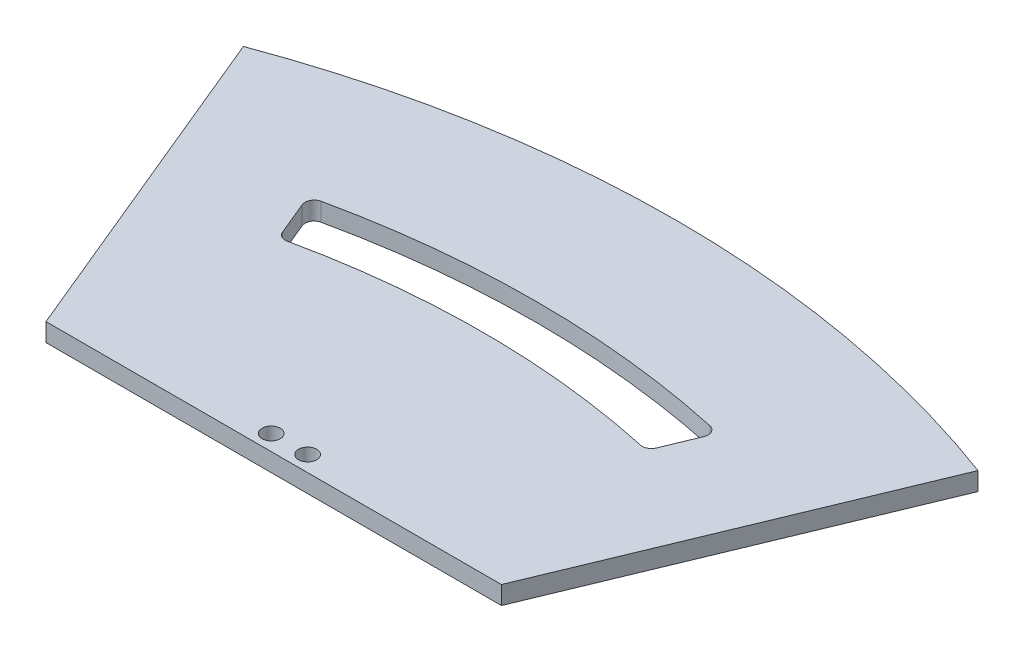
ISO-10303-21;
HEADER;
FILE_DESCRIPTION(('STEP AP214'),'2;1');
FILE_NAME('part.step','',(''),(''),'','','');
FILE_SCHEMA(('AUTOMOTIVE_DESIGN { 1 0 10303 214 1 1 1 1 }'));
ENDSEC;
DATA;
#1=APPLICATION_CONTEXT('core data for automotive mechanical design processes');
#2=APPLICATION_PROTOCOL_DEFINITION('international standard','automotive_design',2000,#1);
#3=PRODUCT_CONTEXT('',#1,'mechanical');
#4=PRODUCT('Part','Part','',(#3));
#5=PRODUCT_RELATED_PRODUCT_CATEGORY('part','',(#4));
#6=PRODUCT_DEFINITION_FORMATION('','',#4);
#7=PRODUCT_DEFINITION_CONTEXT('part definition',#1,'design');
#8=PRODUCT_DEFINITION('design','',#6,#7);
#9=PRODUCT_DEFINITION_SHAPE('','',#8);
#10=(LENGTH_UNIT() NAMED_UNIT(*) SI_UNIT(.MILLI.,.METRE.));
#11=(NAMED_UNIT(*) PLANE_ANGLE_UNIT() SI_UNIT($,.RADIAN.));
#12=(NAMED_UNIT(*) SI_UNIT($,.STERADIAN.) SOLID_ANGLE_UNIT());
#13=UNCERTAINTY_MEASURE_WITH_UNIT(LENGTH_MEASURE(1.E-05),#10,'distance_accuracy_value','');
#14=(GEOMETRIC_REPRESENTATION_CONTEXT(3) GLOBAL_UNCERTAINTY_ASSIGNED_CONTEXT((#13)) GLOBAL_UNIT_ASSIGNED_CONTEXT((#10,
#11,#12)) REPRESENTATION_CONTEXT('',''));
#15=CARTESIAN_POINT('',(0.,0.,0.));
#16=DIRECTION('',(0.,0.,1.));
#17=DIRECTION('',(1.,0.,0.));
#18=AXIS2_PLACEMENT_3D('',#15,#16,#17);
#19=CARTESIAN_POINT('',(0.,-2.5,-1.38777878078145E-13));
#20=DIRECTION('',(0.,-1.,0.));
#21=DIRECTION('',(0.,0.,-1.));
#22=AXIS2_PLACEMENT_3D('',#19,#20,#21);
#23=PLANE('',#22);
#24=CARTESIAN_POINT('',(26.4088077727216,-2.5,-121.666860204509));
#25=DIRECTION('',(0.,1.,0.));
#26=DIRECTION('',(0.,0.,1.));
#27=AXIS2_PLACEMENT_3D('',#24,#25,#26);
#28=CIRCLE('',#27,1.25);
#29=CARTESIAN_POINT('',(27.5636571883608,-2.5,-121.188505914052));
#30=VERTEX_POINT('',#29);
#31=CARTESIAN_POINT('',(26.6739564451385,-2.5,-122.888415025839));
#32=VERTEX_POINT('',#31);
#33=EDGE_CURVE('E75',#30,#32,#28,.T.);
#34=ORIENTED_EDGE('',*,*,#33,.T.);
#35=CARTESIAN_POINT('',(0.,-2.5,-1.38777878078145E-13));
#36=DIRECTION('',(0.,1.,0.));
#37=DIRECTION('',(0.,0.,1.));
#38=AXIS2_PLACEMENT_3D('',#35,#36,#37);
#39=CIRCLE('',#38,125.75);
#40=CARTESIAN_POINT('',(-26.6739564451385,-2.5,-122.888415025839));
#41=VERTEX_POINT('',#40);
#42=EDGE_CURVE('E258',#32,#41,#39,.T.);
#43=ORIENTED_EDGE('',*,*,#42,.T.);
#44=CARTESIAN_POINT('',(-26.4088077727217,-2.5,-121.666860204509));
#45=DIRECTION('',(0.,1.,0.));
#46=DIRECTION('',(0.,0.,1.));
#47=AXIS2_PLACEMENT_3D('',#44,#45,#46);
#48=CIRCLE('',#47,1.25);
#49=CARTESIAN_POINT('',(-27.5636571883608,-2.5,-121.188505914052));
#50=VERTEX_POINT('',#49);
#51=EDGE_CURVE('E50',#41,#50,#48,.T.);
#52=ORIENTED_EDGE('',*,*,#51,.T.);
#53=DIRECTION('',(0.382683432365087,0.,0.923879532511288));
#54=VECTOR('',#53,1.);
#55=CARTESIAN_POINT('',(-27.5636571883608,-2.5,-121.188505914052));
#56=LINE('',#55,#54);
#57=CARTESIAN_POINT('',(-25.6502400265353,-2.5,-116.569108251496));
#58=VERTEX_POINT('',#57);
#59=EDGE_CURVE('E126',#50,#58,#56,.T.);
#60=ORIENTED_EDGE('',*,*,#59,.T.);
#61=CARTESIAN_POINT('',(-24.4953906108962,-2.5,-117.047462541952));
#62=DIRECTION('',(0.,1.,0.));
#63=DIRECTION('',(0.,0.,1.));
#64=AXIS2_PLACEMENT_3D('',#61,#62,#63);
#65=CIRCLE('',#64,1.24999999999999);
#66=CARTESIAN_POINT('',(-24.2302889809081,-2.5,-115.825897510618));
#67=VERTEX_POINT('',#66);
#68=EDGE_CURVE('E254',#58,#67,#65,.T.);
#69=ORIENTED_EDGE('',*,*,#68,.T.);
#70=CARTESIAN_POINT('',(0.,-2.5,-4.17485364670413));
#71=DIRECTION('',(0.,-1.,0.));
#72=DIRECTION('',(0.,0.,1.));
#73=AXIS2_PLACEMENT_3D('',#70,#71,#72);
#74=CIRCLE('',#73,114.25);
#75=CARTESIAN_POINT('',(24.2302889809081,-2.5,-115.825897510618));
#76=VERTEX_POINT('',#75);
#77=EDGE_CURVE('E240',#67,#76,#74,.T.);
#78=ORIENTED_EDGE('',*,*,#77,.T.);
#79=CARTESIAN_POINT('',(24.4953906108962,-2.5,-117.047462541952));
#80=DIRECTION('',(0.,1.,0.));
#81=DIRECTION('',(0.,0.,1.));
#82=AXIS2_PLACEMENT_3D('',#79,#80,#81);
#83=CIRCLE('',#82,1.25);
#84=CARTESIAN_POINT('',(25.6502400265353,-2.5,-116.569108251496));
#85=VERTEX_POINT('',#84);
#86=EDGE_CURVE('E248',#76,#85,#83,.T.);
#87=ORIENTED_EDGE('',*,*,#86,.T.);
#88=DIRECTION('',(0.382683432365089,0.,-0.923879532511287));
#89=VECTOR('',#88,1.);
#90=CARTESIAN_POINT('',(27.5636571883608,-2.5,-121.188505914052));
#91=LINE('',#90,#89);
#92=EDGE_CURVE('E247',#85,#30,#91,.T.);
#93=ORIENTED_EDGE('',*,*,#92,.T.);
#94=EDGE_LOOP('',(#34,#43,#52,#60,#69,#78,#87,#93));
#95=FACE_BOUND('',#94,.T.);
#96=CARTESIAN_POINT('',(-2.5,-2.5,-91.8683298050514));
#97=DIRECTION('',(0.,1.,0.));
#98=DIRECTION('',(0.,0.,1.));
#99=AXIS2_PLACEMENT_3D('',#96,#97,#98);
#100=CIRCLE('',#99,1.25);
#101=CARTESIAN_POINT('',(-2.5,-2.5,-90.6183298050514));
#102=VERTEX_POINT('',#101);
#103=EDGE_CURVE('E135',#102,#102,#100,.T.);
#104=ORIENTED_EDGE('',*,*,#103,.T.);
#105=EDGE_LOOP('',(#104));
#106=FACE_BOUND('',#105,.T.);
#107=CARTESIAN_POINT('',(0.,-2.5,-1.38777878078145E-13));
#108=DIRECTION('',(0.,-1.,0.));
#109=DIRECTION('',(0.,0.,-1.));
#110=AXIS2_PLACEMENT_3D('',#107,#108,#109);
#111=CIRCLE('',#110,145.);
#112=CARTESIAN_POINT('',(-50.404915860436,-2.5,-135.957141986371));
#113=VERTEX_POINT('',#112);
#114=CARTESIAN_POINT('',(50.404915860436,-2.5,-135.957141986371));
#115=VERTEX_POINT('',#114);
#116=EDGE_CURVE('E147',#113,#115,#111,.T.);
#117=ORIENTED_EDGE('',*,*,#116,.T.);
#118=DIRECTION('',(-0.382683432365084,0.,0.92387953251129));
#119=VECTOR('',#118,1.);
#120=CARTESIAN_POINT('',(50.404915860436,-2.5,-135.957141986371));
#121=LINE('',#120,#119);
#122=CARTESIAN_POINT('',(31.25,-2.5,-89.7130843299906));
#123=VERTEX_POINT('',#122);
#124=EDGE_CURVE('E150',#115,#123,#121,.T.);
#125=ORIENTED_EDGE('',*,*,#124,.T.);
#126=DIRECTION('',(1.,0.,0.));
#127=VECTOR('',#126,1.);
#128=CARTESIAN_POINT('',(-31.25,-2.5,-89.7130843299906));
#129=LINE('',#128,#127);
#130=CARTESIAN_POINT('',(-31.25,-2.5,-89.7130843299906));
#131=VERTEX_POINT('',#130);
#132=EDGE_CURVE('E154',#131,#123,#129,.T.);
#133=ORIENTED_EDGE('',*,*,#132,.F.);
#134=DIRECTION('',(0.382683432365084,0.,0.92387953251129));
#135=VECTOR('',#134,1.);
#136=CARTESIAN_POINT('',(-50.404915860436,-2.5,-135.957141986371));
#137=LINE('',#136,#135);
#138=EDGE_CURVE('E157',#113,#131,#137,.T.);
#139=ORIENTED_EDGE('',*,*,#138,.F.);
#140=EDGE_LOOP('',(#117,#125,#133,#139));
#141=FACE_BOUND('',#140,.T.);
#142=CARTESIAN_POINT('',(2.5,-2.5,-91.8683298050514));
#143=DIRECTION('',(0.,1.,0.));
#144=DIRECTION('',(0.,0.,1.));
#145=AXIS2_PLACEMENT_3D('',#142,#143,#144);
#146=CIRCLE('',#145,1.25);
#147=CARTESIAN_POINT('',(2.5,-2.5,-90.6183298050514));
#148=VERTEX_POINT('',#147);
#149=EDGE_CURVE('E141',#148,#148,#146,.F.);
#150=ORIENTED_EDGE('',*,*,#149,.F.);
#151=EDGE_LOOP('',(#150));
#152=FACE_BOUND('',#151,.T.);
#153=ADVANCED_FACE('F32',(#95,#106,#141,#152),#23,.T.);
#154=CARTESIAN_POINT('',(0.,0.,-1.38777878078145E-13));
#155=DIRECTION('',(0.,-1.,0.));
#156=DIRECTION('',(0.,0.,-1.));
#157=AXIS2_PLACEMENT_3D('',#154,#155,#156);
#158=PLANE('',#157);
#159=CARTESIAN_POINT('',(0.,0.,-1.38777878078145E-13));
#160=DIRECTION('',(0.,-1.,0.));
#161=DIRECTION('',(0.,0.,-1.));
#162=AXIS2_PLACEMENT_3D('',#159,#160,#161);
#163=CIRCLE('',#162,125.75);
#164=CARTESIAN_POINT('',(-26.6739564451385,0.,-122.888415025839));
#165=VERTEX_POINT('',#164);
#166=CARTESIAN_POINT('',(26.6739564451385,0.,-122.888415025839));
#167=VERTEX_POINT('',#166);
#168=EDGE_CURVE('E93',#165,#167,#163,.T.);
#169=ORIENTED_EDGE('',*,*,#168,.T.);
#170=CARTESIAN_POINT('',(26.4088077727216,0.,-121.666860204509));
#171=DIRECTION('',(0.,-1.,0.));
#172=DIRECTION('',(0.,0.,-1.));
#173=AXIS2_PLACEMENT_3D('',#170,#171,#172);
#174=CIRCLE('',#173,1.25);
#175=CARTESIAN_POINT('',(27.5636571883608,0.,-121.188505914052));
#176=VERTEX_POINT('',#175);
#177=EDGE_CURVE('E11',#167,#176,#174,.T.);
#178=ORIENTED_EDGE('',*,*,#177,.T.);
#179=DIRECTION('',(-0.382683432365089,0.,0.923879532511287));
#180=VECTOR('',#179,1.);
#181=CARTESIAN_POINT('',(27.5636571883608,0.,-121.188505914052));
#182=LINE('',#181,#180);
#183=CARTESIAN_POINT('',(25.6502400265353,0.,-116.569108251496));
#184=VERTEX_POINT('',#183);
#185=EDGE_CURVE('E36',#176,#184,#182,.T.);
#186=ORIENTED_EDGE('',*,*,#185,.T.);
#187=CARTESIAN_POINT('',(24.4953906108962,0.,-117.047462541952));
#188=DIRECTION('',(0.,-1.,0.));
#189=DIRECTION('',(0.,0.,-1.));
#190=AXIS2_PLACEMENT_3D('',#187,#188,#189);
#191=CIRCLE('',#190,1.25);
#192=CARTESIAN_POINT('',(24.2302889809081,0.,-115.825897510618));
#193=VERTEX_POINT('',#192);
#194=EDGE_CURVE('E88',#184,#193,#191,.T.);
#195=ORIENTED_EDGE('',*,*,#194,.T.);
#196=CARTESIAN_POINT('',(0.,0.,-4.17485364670413));
#197=DIRECTION('',(0.,-1.,0.));
#198=DIRECTION('',(0.,0.,-1.));
#199=AXIS2_PLACEMENT_3D('',#196,#197,#198);
#200=CIRCLE('',#199,114.25);
#201=CARTESIAN_POINT('',(-24.2302889809081,0.,-115.825897510618));
#202=VERTEX_POINT('',#201);
#203=EDGE_CURVE('E110',#193,#202,#200,.F.);
#204=ORIENTED_EDGE('',*,*,#203,.T.);
#205=CARTESIAN_POINT('',(-24.4953906108962,0.,-117.047462541952));
#206=DIRECTION('',(0.,-1.,0.));
#207=DIRECTION('',(0.,0.,-1.));
#208=AXIS2_PLACEMENT_3D('',#205,#206,#207);
#209=CIRCLE('',#208,1.24999999999999);
#210=CARTESIAN_POINT('',(-25.6502400265353,0.,-116.569108251496));
#211=VERTEX_POINT('',#210);
#212=EDGE_CURVE('E107',#202,#211,#209,.T.);
#213=ORIENTED_EDGE('',*,*,#212,.T.);
#214=DIRECTION('',(-0.382683432365087,0.,-0.923879532511288));
#215=VECTOR('',#214,1.);
#216=CARTESIAN_POINT('',(-25.6502400265353,0.,-116.569108251496));
#217=LINE('',#216,#215);
#218=CARTESIAN_POINT('',(-27.5636571883608,0.,-121.188505914052));
#219=VERTEX_POINT('',#218);
#220=EDGE_CURVE('E100',#211,#219,#217,.T.);
#221=ORIENTED_EDGE('',*,*,#220,.T.);
#222=CARTESIAN_POINT('',(-26.4088077727217,0.,-121.666860204509));
#223=DIRECTION('',(0.,-1.,0.));
#224=DIRECTION('',(0.,0.,-1.));
#225=AXIS2_PLACEMENT_3D('',#222,#223,#224);
#226=CIRCLE('',#225,1.25);
#227=EDGE_CURVE('E96',#219,#165,#226,.T.);
#228=ORIENTED_EDGE('',*,*,#227,.T.);
#229=EDGE_LOOP('',(#169,#178,#186,#195,#204,#213,#221,#228));
#230=FACE_BOUND('',#229,.T.);
#231=CARTESIAN_POINT('',(-2.5,0.,-91.8683298050514));
#232=DIRECTION('',(0.,1.,0.));
#233=DIRECTION('',(0.,0.,1.));
#234=AXIS2_PLACEMENT_3D('',#231,#232,#233);
#235=CIRCLE('',#234,1.25);
#236=CARTESIAN_POINT('',(-2.5,0.,-90.6183298050514));
#237=VERTEX_POINT('',#236);
#238=EDGE_CURVE('E79',#237,#237,#235,.T.);
#239=ORIENTED_EDGE('',*,*,#238,.F.);
#240=EDGE_LOOP('',(#239));
#241=FACE_BOUND('',#240,.T.);
#242=CARTESIAN_POINT('',(2.5,0.,-91.8683298050514));
#243=DIRECTION('',(0.,1.,0.));
#244=DIRECTION('',(0.,0.,1.));
#245=AXIS2_PLACEMENT_3D('',#242,#243,#244);
#246=CIRCLE('',#245,1.25);
#247=CARTESIAN_POINT('',(2.5,0.,-90.6183298050514));
#248=VERTEX_POINT('',#247);
#249=EDGE_CURVE('E138',#248,#248,#246,.F.);
#250=ORIENTED_EDGE('',*,*,#249,.T.);
#251=EDGE_LOOP('',(#250));
#252=FACE_BOUND('',#251,.T.);
#253=CARTESIAN_POINT('',(0.,0.,-1.38777878078145E-13));
#254=DIRECTION('',(0.,-1.,0.));
#255=DIRECTION('',(0.,0.,-1.));
#256=AXIS2_PLACEMENT_3D('',#253,#254,#255);
#257=CIRCLE('',#256,145.);
#258=CARTESIAN_POINT('',(-50.404915860436,0.,-135.957141986371));
#259=VERTEX_POINT('',#258);
#260=CARTESIAN_POINT('',(50.404915860436,0.,-135.957141986371));
#261=VERTEX_POINT('',#260);
#262=EDGE_CURVE('E144',#259,#261,#257,.T.);
#263=ORIENTED_EDGE('',*,*,#262,.F.);
#264=DIRECTION('',(0.382683432365084,0.,0.92387953251129));
#265=VECTOR('',#264,1.);
#266=CARTESIAN_POINT('',(-50.404915860436,0.,-135.957141986371));
#267=LINE('',#266,#265);
#268=CARTESIAN_POINT('',(-31.25,0.,-89.7130843299906));
#269=VERTEX_POINT('',#268);
#270=EDGE_CURVE('E151',#259,#269,#267,.T.);
#271=ORIENTED_EDGE('',*,*,#270,.T.);
#272=DIRECTION('',(1.,0.,0.));
#273=VECTOR('',#272,1.);
#274=CARTESIAN_POINT('',(-31.25,0.,-89.7130843299906));
#275=LINE('',#274,#273);
#276=CARTESIAN_POINT('',(31.25,0.,-89.7130843299906));
#277=VERTEX_POINT('',#276);
#278=EDGE_CURVE('E166',#269,#277,#275,.T.);
#279=ORIENTED_EDGE('',*,*,#278,.T.);
#280=DIRECTION('',(-0.382683432365084,0.,0.92387953251129));
#281=VECTOR('',#280,1.);
#282=CARTESIAN_POINT('',(50.404915860436,0.,-135.957141986371));
#283=LINE('',#282,#281);
#284=EDGE_CURVE('E163',#261,#277,#283,.T.);
#285=ORIENTED_EDGE('',*,*,#284,.F.);
#286=EDGE_LOOP('',(#263,#271,#279,#285));
#287=FACE_BOUND('',#286,.T.);
#288=ADVANCED_FACE('F89',(#230,#241,#252,#287),#158,.F.);
#289=CARTESIAN_POINT('',(0.,-2.5,-1.38777878078145E-13));
#290=DIRECTION('',(0.,1.,0.));
#291=DIRECTION('',(0.,0.,1.));
#292=AXIS2_PLACEMENT_3D('',#289,#290,#291);
#293=CYLINDRICAL_SURFACE('',#292,145.);
#294=ORIENTED_EDGE('',*,*,#262,.T.);
#295=DIRECTION('',(0.,1.,0.));
#296=VECTOR('',#295,1.);
#297=CARTESIAN_POINT('',(50.404915860436,-2.5,-135.957141986371));
#298=LINE('',#297,#296);
#299=EDGE_CURVE('E98',#115,#261,#298,.T.);
#300=ORIENTED_EDGE('',*,*,#299,.F.);
#301=ORIENTED_EDGE('',*,*,#116,.F.);
#302=DIRECTION('',(0.,1.,0.));
#303=VECTOR('',#302,1.);
#304=CARTESIAN_POINT('',(-50.404915860436,-2.5,-135.957141986371));
#305=LINE('',#304,#303);
#306=EDGE_CURVE('E160',#113,#259,#305,.T.);
#307=ORIENTED_EDGE('',*,*,#306,.T.);
#308=EDGE_LOOP('',(#294,#300,#301,#307));
#309=FACE_BOUND('',#308,.T.);
#310=ADVANCED_FACE('F34',(#309),#293,.T.);
#311=CARTESIAN_POINT('',(50.404915860436,-2.5,-135.957141986371));
#312=DIRECTION('',(-0.923879532511289,0.,-0.382683432365084));
#313=DIRECTION('',(-0.382683432365084,0.,0.923879532511289));
#314=AXIS2_PLACEMENT_3D('',#311,#312,#313);
#315=PLANE('',#314);
#316=ORIENTED_EDGE('',*,*,#284,.T.);
#317=DIRECTION('',(0.,1.,0.));
#318=VECTOR('',#317,1.);
#319=CARTESIAN_POINT('',(31.25,-2.5,-89.7130843299906));
#320=LINE('',#319,#318);
#321=EDGE_CURVE('E103',#123,#277,#320,.T.);
#322=ORIENTED_EDGE('',*,*,#321,.F.);
#323=ORIENTED_EDGE('',*,*,#124,.F.);
#324=ORIENTED_EDGE('',*,*,#299,.T.);
#325=EDGE_LOOP('',(#316,#322,#323,#324));
#326=FACE_BOUND('',#325,.T.);
#327=ADVANCED_FACE('F190',(#326),#315,.F.);
#328=CARTESIAN_POINT('',(-31.25,-2.5,-89.7130843299906));
#329=DIRECTION('',(0.,0.,1.));
#330=DIRECTION('',(1.,0.,0.));
#331=AXIS2_PLACEMENT_3D('',#328,#329,#330);
#332=PLANE('',#331);
#333=ORIENTED_EDGE('',*,*,#278,.F.);
#334=DIRECTION('',(0.,1.,0.));
#335=VECTOR('',#334,1.);
#336=CARTESIAN_POINT('',(-31.25,-2.5,-89.7130843299906));
#337=LINE('',#336,#335);
#338=EDGE_CURVE('E173',#131,#269,#337,.T.);
#339=ORIENTED_EDGE('',*,*,#338,.F.);
#340=ORIENTED_EDGE('',*,*,#132,.T.);
#341=ORIENTED_EDGE('',*,*,#321,.T.);
#342=EDGE_LOOP('',(#333,#339,#340,#341));
#343=FACE_BOUND('',#342,.T.);
#344=ADVANCED_FACE('F180',(#343),#332,.T.);
#345=CARTESIAN_POINT('',(-50.404915860436,-2.5,-135.957141986371));
#346=DIRECTION('',(-0.923879532511289,0.,0.382683432365084));
#347=DIRECTION('',(0.382683432365084,0.,0.923879532511289));
#348=AXIS2_PLACEMENT_3D('',#345,#346,#347);
#349=PLANE('',#348);
#350=ORIENTED_EDGE('',*,*,#270,.F.);
#351=ORIENTED_EDGE('',*,*,#306,.F.);
#352=ORIENTED_EDGE('',*,*,#138,.T.);
#353=ORIENTED_EDGE('',*,*,#338,.T.);
#354=EDGE_LOOP('',(#350,#351,#352,#353));
#355=FACE_BOUND('',#354,.T.);
#356=ADVANCED_FACE('F199',(#355),#349,.T.);
#357=CARTESIAN_POINT('',(2.5,-2.5,-91.8683298050514));
#358=DIRECTION('',(0.,1.,0.));
#359=DIRECTION('',(0.,0.,1.));
#360=AXIS2_PLACEMENT_3D('',#357,#358,#359);
#361=CYLINDRICAL_SURFACE('',#360,1.25);
#362=ORIENTED_EDGE('',*,*,#149,.T.);
#363=EDGE_LOOP('',(#362));
#364=FACE_BOUND('',#363,.T.);
#365=ORIENTED_EDGE('',*,*,#249,.F.);
#366=EDGE_LOOP('',(#365));
#367=FACE_BOUND('',#366,.T.);
#368=ADVANCED_FACE('F280',(#364,#367),#361,.F.);
#369=CARTESIAN_POINT('',(-2.5,-2.5,-91.8683298050514));
#370=DIRECTION('',(0.,1.,0.));
#371=DIRECTION('',(0.,0.,1.));
#372=AXIS2_PLACEMENT_3D('',#369,#370,#371);
#373=CYLINDRICAL_SURFACE('',#372,1.25);
#374=ORIENTED_EDGE('',*,*,#103,.F.);
#375=EDGE_LOOP('',(#374));
#376=FACE_BOUND('',#375,.T.);
#377=ORIENTED_EDGE('',*,*,#238,.T.);
#378=EDGE_LOOP('',(#377));
#379=FACE_BOUND('',#378,.T.);
#380=ADVANCED_FACE('F299',(#376,#379),#373,.F.);
#381=CARTESIAN_POINT('',(26.4088077727216,-2.5,-121.666860204509));
#382=DIRECTION('',(0.,1.,0.));
#383=DIRECTION('',(0.,0.,1.));
#384=AXIS2_PLACEMENT_3D('',#381,#382,#383);
#385=CYLINDRICAL_SURFACE('',#384,1.25);
#386=DIRECTION('',(0.,1.,0.));
#387=VECTOR('',#386,1.);
#388=CARTESIAN_POINT('',(26.6739564451385,-2.5,-122.888415025839));
#389=LINE('',#388,#387);
#390=EDGE_CURVE('E131',#32,#167,#389,.T.);
#391=ORIENTED_EDGE('',*,*,#390,.F.);
#392=ORIENTED_EDGE('',*,*,#33,.F.);
#393=DIRECTION('',(0.,1.,0.));
#394=VECTOR('',#393,1.);
#395=CARTESIAN_POINT('',(27.5636571883608,-2.5,-121.188505914052));
#396=LINE('',#395,#394);
#397=EDGE_CURVE('E68',#30,#176,#396,.T.);
#398=ORIENTED_EDGE('',*,*,#397,.T.);
#399=ORIENTED_EDGE('',*,*,#177,.F.);
#400=EDGE_LOOP('',(#391,#392,#398,#399));
#401=FACE_BOUND('',#400,.T.);
#402=ADVANCED_FACE('F71',(#401),#385,.F.);
#403=CARTESIAN_POINT('',(27.5636571883608,-2.5,-121.188505914052));
#404=DIRECTION('',(0.923879532511287,0.,0.382683432365089));
#405=DIRECTION('',(0.382683432365089,0.,-0.923879532511287));
#406=AXIS2_PLACEMENT_3D('',#403,#404,#405);
#407=PLANE('',#406);
#408=ORIENTED_EDGE('',*,*,#397,.F.);
#409=ORIENTED_EDGE('',*,*,#92,.F.);
#410=DIRECTION('',(0.,1.,0.));
#411=VECTOR('',#410,1.);
#412=CARTESIAN_POINT('',(25.6502400265353,-2.5,-116.569108251496));
#413=LINE('',#412,#411);
#414=EDGE_CURVE('E80',#85,#184,#413,.T.);
#415=ORIENTED_EDGE('',*,*,#414,.T.);
#416=ORIENTED_EDGE('',*,*,#185,.F.);
#417=EDGE_LOOP('',(#408,#409,#415,#416));
#418=FACE_BOUND('',#417,.T.);
#419=ADVANCED_FACE('F84',(#418),#407,.F.);
#420=CARTESIAN_POINT('',(24.4953906108962,-2.5,-117.047462541952));
#421=DIRECTION('',(0.,1.,0.));
#422=DIRECTION('',(0.,0.,1.));
#423=AXIS2_PLACEMENT_3D('',#420,#421,#422);
#424=CYLINDRICAL_SURFACE('',#423,1.25);
#425=ORIENTED_EDGE('',*,*,#414,.F.);
#426=ORIENTED_EDGE('',*,*,#86,.F.);
#427=DIRECTION('',(0.,1.,0.));
#428=VECTOR('',#427,1.);
#429=CARTESIAN_POINT('',(24.2302889809081,-2.5,-115.825897510618));
#430=LINE('',#429,#428);
#431=EDGE_CURVE('E234',#76,#193,#430,.T.);
#432=ORIENTED_EDGE('',*,*,#431,.T.);
#433=ORIENTED_EDGE('',*,*,#194,.F.);
#434=EDGE_LOOP('',(#425,#426,#432,#433));
#435=FACE_BOUND('',#434,.T.);
#436=ADVANCED_FACE('F232',(#435),#424,.F.);
#437=CARTESIAN_POINT('',(0.,-2.5,-4.17485364670413));
#438=DIRECTION('',(0.,1.,0.));
#439=DIRECTION('',(0.,0.,1.));
#440=AXIS2_PLACEMENT_3D('',#437,#438,#439);
#441=CYLINDRICAL_SURFACE('',#440,114.25);
#442=ORIENTED_EDGE('',*,*,#431,.F.);
#443=ORIENTED_EDGE('',*,*,#77,.F.);
#444=DIRECTION('',(0.,1.,0.));
#445=VECTOR('',#444,1.);
#446=CARTESIAN_POINT('',(-24.2302889809081,-2.5,-115.825897510618));
#447=LINE('',#446,#445);
#448=EDGE_CURVE('E129',#67,#202,#447,.T.);
#449=ORIENTED_EDGE('',*,*,#448,.T.);
#450=ORIENTED_EDGE('',*,*,#203,.F.);
#451=EDGE_LOOP('',(#442,#443,#449,#450));
#452=FACE_BOUND('',#451,.T.);
#453=ADVANCED_FACE('F237',(#452),#441,.T.);
#454=CARTESIAN_POINT('',(-24.4953906108962,-2.5,-117.047462541952));
#455=DIRECTION('',(0.,1.,0.));
#456=DIRECTION('',(0.,0.,1.));
#457=AXIS2_PLACEMENT_3D('',#454,#455,#456);
#458=CYLINDRICAL_SURFACE('',#457,1.24999999999999);
#459=ORIENTED_EDGE('',*,*,#448,.F.);
#460=ORIENTED_EDGE('',*,*,#68,.F.);
#461=DIRECTION('',(0.,1.,0.));
#462=VECTOR('',#461,1.);
#463=CARTESIAN_POINT('',(-25.6502400265353,-2.5,-116.569108251496));
#464=LINE('',#463,#462);
#465=EDGE_CURVE('E121',#58,#211,#464,.T.);
#466=ORIENTED_EDGE('',*,*,#465,.T.);
#467=ORIENTED_EDGE('',*,*,#212,.F.);
#468=EDGE_LOOP('',(#459,#460,#466,#467));
#469=FACE_BOUND('',#468,.T.);
#470=ADVANCED_FACE('F271',(#469),#458,.F.);
#471=CARTESIAN_POINT('',(-27.5636571883608,-2.5,-121.188505914052));
#472=DIRECTION('',(-0.923879532511288,0.,0.382683432365087));
#473=DIRECTION('',(0.382683432365087,0.,0.923879532511288));
#474=AXIS2_PLACEMENT_3D('',#471,#472,#473);
#475=PLANE('',#474);
#476=ORIENTED_EDGE('',*,*,#465,.F.);
#477=ORIENTED_EDGE('',*,*,#59,.F.);
#478=DIRECTION('',(0.,1.,0.));
#479=VECTOR('',#478,1.);
#480=CARTESIAN_POINT('',(-27.5636571883608,-2.5,-121.188505914052));
#481=LINE('',#480,#479);
#482=EDGE_CURVE('E123',#50,#219,#481,.T.);
#483=ORIENTED_EDGE('',*,*,#482,.T.);
#484=ORIENTED_EDGE('',*,*,#220,.F.);
#485=EDGE_LOOP('',(#476,#477,#483,#484));
#486=FACE_BOUND('',#485,.T.);
#487=ADVANCED_FACE('F118',(#486),#475,.F.);
#488=CARTESIAN_POINT('',(-26.4088077727217,-2.5,-121.666860204509));
#489=DIRECTION('',(0.,1.,0.));
#490=DIRECTION('',(0.,0.,1.));
#491=AXIS2_PLACEMENT_3D('',#488,#489,#490);
#492=CYLINDRICAL_SURFACE('',#491,1.25);
#493=ORIENTED_EDGE('',*,*,#482,.F.);
#494=ORIENTED_EDGE('',*,*,#51,.F.);
#495=DIRECTION('',(0.,1.,0.));
#496=VECTOR('',#495,1.);
#497=CARTESIAN_POINT('',(-26.6739564451385,-2.5,-122.888415025839));
#498=LINE('',#497,#496);
#499=EDGE_CURVE('E127',#41,#165,#498,.T.);
#500=ORIENTED_EDGE('',*,*,#499,.T.);
#501=ORIENTED_EDGE('',*,*,#227,.F.);
#502=EDGE_LOOP('',(#493,#494,#500,#501));
#503=FACE_BOUND('',#502,.T.);
#504=ADVANCED_FACE('F263',(#503),#492,.F.);
#505=CARTESIAN_POINT('',(0.,-2.5,-1.38777878078145E-13));
#506=DIRECTION('',(0.,1.,0.));
#507=DIRECTION('',(0.,0.,1.));
#508=AXIS2_PLACEMENT_3D('',#505,#506,#507);
#509=CYLINDRICAL_SURFACE('',#508,125.75);
#510=ORIENTED_EDGE('',*,*,#499,.F.);
#511=ORIENTED_EDGE('',*,*,#42,.F.);
#512=ORIENTED_EDGE('',*,*,#390,.T.);
#513=ORIENTED_EDGE('',*,*,#168,.F.);
#514=EDGE_LOOP('',(#510,#511,#512,#513));
#515=FACE_BOUND('',#514,.T.);
#516=ADVANCED_FACE('F262',(#515),#509,.F.);
#517=CLOSED_SHELL('',(#153,#288,#310,#327,#344,#356,#368,#380,#402,#419,#436,#453,#470,#487,
#504,#516));
#518=MANIFOLD_SOLID_BREP('B2',#517);
#519=ADVANCED_BREP_SHAPE_REPRESENTATION('',(#18,#518),#14);
#520=SHAPE_DEFINITION_REPRESENTATION(#9,#519);
ENDSEC;
END-ISO-10303-21;
